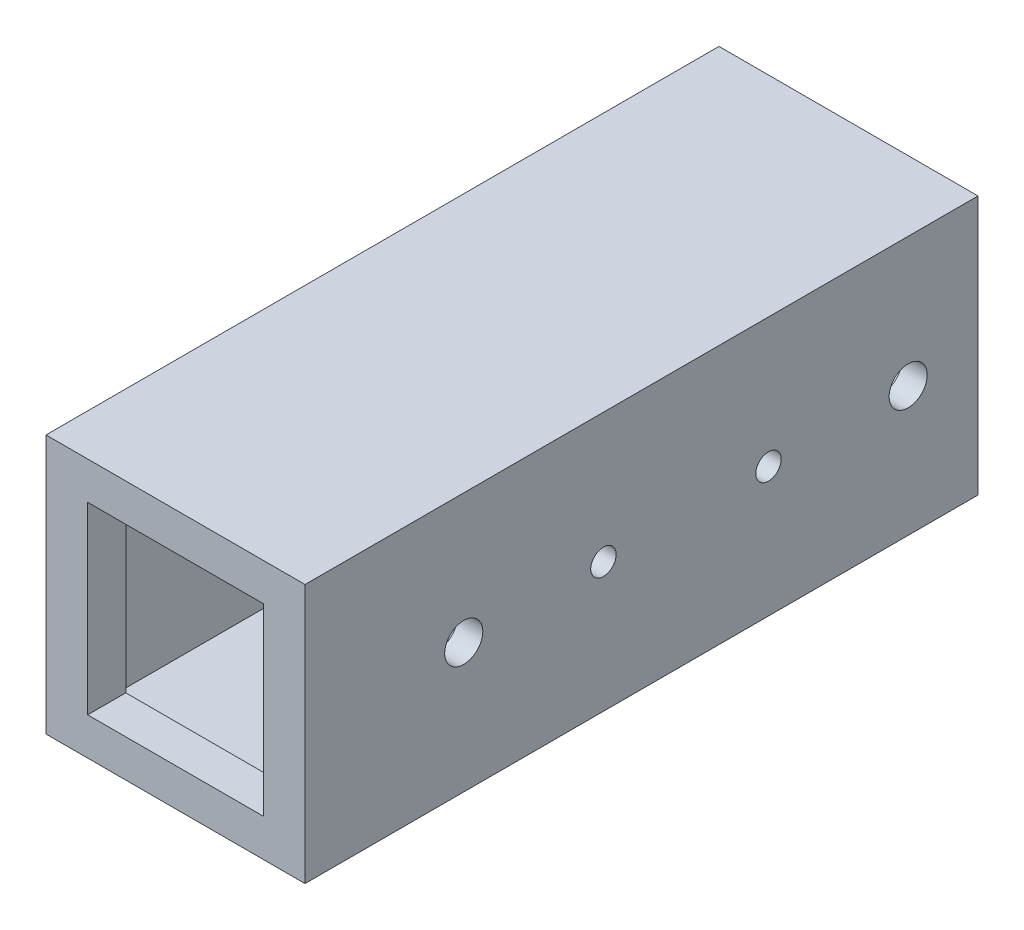
ISO-10303-21;
HEADER;
FILE_DESCRIPTION(('STEP AP214'),'2;1');
FILE_NAME('part.step','',(''),(''),'','','');
FILE_SCHEMA(('AUTOMOTIVE_DESIGN { 1 0 10303 214 1 1 1 1 }'));
ENDSEC;
DATA;
#1=APPLICATION_CONTEXT('core data for automotive mechanical design processes');
#2=APPLICATION_PROTOCOL_DEFINITION('international standard','automotive_design',2000,#1);
#3=PRODUCT_CONTEXT('',#1,'mechanical');
#4=PRODUCT('Part','Part','',(#3));
#5=PRODUCT_RELATED_PRODUCT_CATEGORY('part','',(#4));
#6=PRODUCT_DEFINITION_FORMATION('','',#4);
#7=PRODUCT_DEFINITION_CONTEXT('part definition',#1,'design');
#8=PRODUCT_DEFINITION('design','',#6,#7);
#9=PRODUCT_DEFINITION_SHAPE('','',#8);
#10=(LENGTH_UNIT() NAMED_UNIT(*) SI_UNIT(.MILLI.,.METRE.));
#11=(NAMED_UNIT(*) PLANE_ANGLE_UNIT() SI_UNIT($,.RADIAN.));
#12=(NAMED_UNIT(*) SI_UNIT($,.STERADIAN.) SOLID_ANGLE_UNIT());
#13=UNCERTAINTY_MEASURE_WITH_UNIT(LENGTH_MEASURE(1.E-05),#10,'distance_accuracy_value','');
#14=(GEOMETRIC_REPRESENTATION_CONTEXT(3) GLOBAL_UNCERTAINTY_ASSIGNED_CONTEXT((#13)) GLOBAL_UNIT_ASSIGNED_CONTEXT((#10,
#11,#12)) REPRESENTATION_CONTEXT('',''));
#15=CARTESIAN_POINT('',(0.,0.,0.));
#16=DIRECTION('',(0.,0.,1.));
#17=DIRECTION('',(1.,0.,0.));
#18=AXIS2_PLACEMENT_3D('',#15,#16,#17);
#19=CARTESIAN_POINT('',(10.2,-10.2,-50.));
#20=DIRECTION('',(1.,0.,0.));
#21=DIRECTION('',(0.,0.,-1.));
#22=AXIS2_PLACEMENT_3D('',#19,#20,#21);
#23=PLANE('',#22);
#24=CARTESIAN_POINT('',(10.2,0.,-44.5));
#25=DIRECTION('',(1.,0.,0.));
#26=DIRECTION('',(0.,0.,-1.));
#27=AXIS2_PLACEMENT_3D('',#24,#25,#26);
#28=CIRCLE('',#27,1.5);
#29=CARTESIAN_POINT('',(10.2,0.,-46.));
#30=VERTEX_POINT('',#29);
#31=EDGE_CURVE('E282',#30,#30,#28,.T.);
#32=ORIENTED_EDGE('',*,*,#31,.F.);
#33=EDGE_LOOP('',(#32));
#34=FACE_BOUND('',#33,.T.);
#35=CARTESIAN_POINT('',(10.2,0.,-33.5));
#36=DIRECTION('',(1.,0.,0.));
#37=DIRECTION('',(0.,0.,-1.));
#38=AXIS2_PLACEMENT_3D('',#35,#36,#37);
#39=CIRCLE('',#38,0.999999999999998);
#40=CARTESIAN_POINT('',(10.2,0.,-34.5));
#41=VERTEX_POINT('',#40);
#42=EDGE_CURVE('E670',#41,#41,#39,.T.);
#43=ORIENTED_EDGE('',*,*,#42,.F.);
#44=EDGE_LOOP('',(#43));
#45=FACE_BOUND('',#44,.T.);
#46=CARTESIAN_POINT('',(10.2,0.,-9.5));
#47=DIRECTION('',(1.,0.,0.));
#48=DIRECTION('',(0.,0.,-1.));
#49=AXIS2_PLACEMENT_3D('',#46,#47,#48);
#50=CIRCLE('',#49,1.5);
#51=CARTESIAN_POINT('',(10.2,0.,-11.));
#52=VERTEX_POINT('',#51);
#53=EDGE_CURVE('E296',#52,#52,#50,.T.);
#54=ORIENTED_EDGE('',*,*,#53,.F.);
#55=EDGE_LOOP('',(#54));
#56=FACE_BOUND('',#55,.T.);
#57=CARTESIAN_POINT('',(10.2,0.,-20.5));
#58=DIRECTION('',(1.,0.,0.));
#59=DIRECTION('',(0.,0.,-1.));
#60=AXIS2_PLACEMENT_3D('',#57,#58,#59);
#61=CIRCLE('',#60,0.999999999999998);
#62=CARTESIAN_POINT('',(10.2,0.,-21.5));
#63=VERTEX_POINT('',#62);
#64=EDGE_CURVE('E293',#63,#63,#61,.T.);
#65=ORIENTED_EDGE('',*,*,#64,.F.);
#66=EDGE_LOOP('',(#65));
#67=FACE_BOUND('',#66,.T.);
#68=DIRECTION('',(0.,0.,1.));
#69=VECTOR('',#68,1.);
#70=CARTESIAN_POINT('',(10.2,10.2,-50.));
#71=LINE('',#70,#69);
#72=CARTESIAN_POINT('',(10.2,10.2,-50.));
#73=VERTEX_POINT('',#72);
#74=CARTESIAN_POINT('',(10.2,10.2,3.));
#75=VERTEX_POINT('',#74);
#76=EDGE_CURVE('E228',#73,#75,#71,.T.);
#77=ORIENTED_EDGE('',*,*,#76,.T.);
#78=DIRECTION('',(0.,1.,0.));
#79=VECTOR('',#78,1.);
#80=CARTESIAN_POINT('',(10.2,10.2,3.));
#81=LINE('',#80,#79);
#82=CARTESIAN_POINT('',(10.2,-10.2,3.));
#83=VERTEX_POINT('',#82);
#84=EDGE_CURVE('E159',#83,#75,#81,.T.);
#85=ORIENTED_EDGE('',*,*,#84,.F.);
#86=DIRECTION('',(0.,0.,1.));
#87=VECTOR('',#86,1.);
#88=CARTESIAN_POINT('',(10.2,-10.2,-50.));
#89=LINE('',#88,#87);
#90=CARTESIAN_POINT('',(10.2,-10.2,-50.));
#91=VERTEX_POINT('',#90);
#92=EDGE_CURVE('E229',#91,#83,#89,.T.);
#93=ORIENTED_EDGE('',*,*,#92,.F.);
#94=DIRECTION('',(0.,1.,0.));
#95=VECTOR('',#94,1.);
#96=CARTESIAN_POINT('',(10.2,-10.2,-50.));
#97=LINE('',#96,#95);
#98=EDGE_CURVE('E211',#91,#73,#97,.T.);
#99=ORIENTED_EDGE('',*,*,#98,.T.);
#100=EDGE_LOOP('',(#77,#85,#93,#99));
#101=FACE_BOUND('',#100,.T.);
#102=ADVANCED_FACE('F39',(#34,#45,#56,#67,#101),#23,.T.);
#103=CARTESIAN_POINT('',(-10.2,-10.2,-50.));
#104=DIRECTION('',(0.,-1.,0.));
#105=DIRECTION('',(0.,0.,-1.));
#106=AXIS2_PLACEMENT_3D('',#103,#104,#105);
#107=PLANE('',#106);
#108=ORIENTED_EDGE('',*,*,#92,.T.);
#109=DIRECTION('',(1.,0.,0.));
#110=VECTOR('',#109,1.);
#111=CARTESIAN_POINT('',(10.2,-10.2,3.));
#112=LINE('',#111,#110);
#113=CARTESIAN_POINT('',(-10.2,-10.2,3.));
#114=VERTEX_POINT('',#113);
#115=EDGE_CURVE('E193',#114,#83,#112,.T.);
#116=ORIENTED_EDGE('',*,*,#115,.F.);
#117=DIRECTION('',(0.,0.,1.));
#118=VECTOR('',#117,1.);
#119=CARTESIAN_POINT('',(-10.2,-10.2,-50.));
#120=LINE('',#119,#118);
#121=CARTESIAN_POINT('',(-10.2,-10.2,-50.));
#122=VERTEX_POINT('',#121);
#123=EDGE_CURVE('E232',#122,#114,#120,.T.);
#124=ORIENTED_EDGE('',*,*,#123,.F.);
#125=DIRECTION('',(1.,0.,0.));
#126=VECTOR('',#125,1.);
#127=CARTESIAN_POINT('',(-10.2,-10.2,-50.));
#128=LINE('',#127,#126);
#129=EDGE_CURVE('E225',#122,#91,#128,.T.);
#130=ORIENTED_EDGE('',*,*,#129,.T.);
#131=EDGE_LOOP('',(#108,#116,#124,#130));
#132=FACE_BOUND('',#131,.T.);
#133=ADVANCED_FACE('F329',(#132),#107,.T.);
#134=CARTESIAN_POINT('',(-10.2,-10.2,-50.));
#135=DIRECTION('',(-1.,0.,0.));
#136=DIRECTION('',(0.,0.,1.));
#137=AXIS2_PLACEMENT_3D('',#134,#135,#136);
#138=PLANE('',#137);
#139=CARTESIAN_POINT('',(-10.2,0.,-44.5));
#140=DIRECTION('',(1.,0.,0.));
#141=DIRECTION('',(0.,0.,-1.));
#142=AXIS2_PLACEMENT_3D('',#139,#140,#141);
#143=CIRCLE('',#142,1.5);
#144=CARTESIAN_POINT('',(-10.2,0.,-46.));
#145=VERTEX_POINT('',#144);
#146=EDGE_CURVE('E277',#145,#145,#143,.T.);
#147=ORIENTED_EDGE('',*,*,#146,.T.);
#148=EDGE_LOOP('',(#147));
#149=FACE_BOUND('',#148,.T.);
#150=CARTESIAN_POINT('',(-10.2,0.,-33.5));
#151=DIRECTION('',(1.,0.,0.));
#152=DIRECTION('',(0.,0.,-1.));
#153=AXIS2_PLACEMENT_3D('',#150,#151,#152);
#154=CIRCLE('',#153,0.999999999999998);
#155=CARTESIAN_POINT('',(-10.2,0.,-34.5));
#156=VERTEX_POINT('',#155);
#157=EDGE_CURVE('E287',#156,#156,#154,.T.);
#158=ORIENTED_EDGE('',*,*,#157,.T.);
#159=EDGE_LOOP('',(#158));
#160=FACE_BOUND('',#159,.T.);
#161=CARTESIAN_POINT('',(-10.2,0.,-9.5));
#162=DIRECTION('',(1.,0.,0.));
#163=DIRECTION('',(0.,0.,-1.));
#164=AXIS2_PLACEMENT_3D('',#161,#162,#163);
#165=CIRCLE('',#164,1.5);
#166=CARTESIAN_POINT('',(-10.2,0.,-11.));
#167=VERTEX_POINT('',#166);
#168=EDGE_CURVE('E668',#167,#167,#165,.T.);
#169=ORIENTED_EDGE('',*,*,#168,.T.);
#170=EDGE_LOOP('',(#169));
#171=FACE_BOUND('',#170,.T.);
#172=CARTESIAN_POINT('',(-10.2,0.,-20.5));
#173=DIRECTION('',(1.,0.,0.));
#174=DIRECTION('',(0.,0.,-1.));
#175=AXIS2_PLACEMENT_3D('',#172,#173,#174);
#176=CIRCLE('',#175,0.999999999999998);
#177=CARTESIAN_POINT('',(-10.2,0.,-21.5));
#178=VERTEX_POINT('',#177);
#179=EDGE_CURVE('E241',#178,#178,#176,.T.);
#180=ORIENTED_EDGE('',*,*,#179,.T.);
#181=EDGE_LOOP('',(#180));
#182=FACE_BOUND('',#181,.T.);
#183=ORIENTED_EDGE('',*,*,#123,.T.);
#184=DIRECTION('',(0.,-1.,0.));
#185=VECTOR('',#184,1.);
#186=CARTESIAN_POINT('',(-10.2,10.2,3.));
#187=LINE('',#186,#185);
#188=CARTESIAN_POINT('',(-10.2,10.2,3.));
#189=VERTEX_POINT('',#188);
#190=EDGE_CURVE('E190',#189,#114,#187,.T.);
#191=ORIENTED_EDGE('',*,*,#190,.F.);
#192=DIRECTION('',(0.,0.,1.));
#193=VECTOR('',#192,1.);
#194=CARTESIAN_POINT('',(-10.2,10.2,-50.));
#195=LINE('',#194,#193);
#196=CARTESIAN_POINT('',(-10.2,10.2,-50.));
#197=VERTEX_POINT('',#196);
#198=EDGE_CURVE('E234',#197,#189,#195,.T.);
#199=ORIENTED_EDGE('',*,*,#198,.F.);
#200=DIRECTION('',(0.,-1.,0.));
#201=VECTOR('',#200,1.);
#202=CARTESIAN_POINT('',(-10.2,-10.2,-50.));
#203=LINE('',#202,#201);
#204=EDGE_CURVE('E222',#197,#122,#203,.T.);
#205=ORIENTED_EDGE('',*,*,#204,.T.);
#206=EDGE_LOOP('',(#183,#191,#199,#205));
#207=FACE_BOUND('',#206,.T.);
#208=ADVANCED_FACE('F335',(#149,#160,#171,#182,#207),#138,.T.);
#209=CARTESIAN_POINT('',(-10.2,10.2,-50.));
#210=DIRECTION('',(0.,1.,0.));
#211=DIRECTION('',(0.,0.,1.));
#212=AXIS2_PLACEMENT_3D('',#209,#210,#211);
#213=PLANE('',#212);
#214=ORIENTED_EDGE('',*,*,#198,.T.);
#215=DIRECTION('',(-1.,0.,0.));
#216=VECTOR('',#215,1.);
#217=CARTESIAN_POINT('',(10.2,10.2,3.));
#218=LINE('',#217,#216);
#219=EDGE_CURVE('E187',#75,#189,#218,.T.);
#220=ORIENTED_EDGE('',*,*,#219,.F.);
#221=ORIENTED_EDGE('',*,*,#76,.F.);
#222=DIRECTION('',(-1.,0.,0.));
#223=VECTOR('',#222,1.);
#224=CARTESIAN_POINT('',(-10.2,10.2,-50.));
#225=LINE('',#224,#223);
#226=EDGE_CURVE('E219',#73,#197,#225,.T.);
#227=ORIENTED_EDGE('',*,*,#226,.T.);
#228=EDGE_LOOP('',(#214,#220,#221,#227));
#229=FACE_BOUND('',#228,.T.);
#230=ADVANCED_FACE('F342',(#229),#213,.T.);
#231=CARTESIAN_POINT('',(0.,0.,-50.));
#232=DIRECTION('',(0.,0.,-1.));
#233=DIRECTION('',(-1.,0.,0.));
#234=AXIS2_PLACEMENT_3D('',#231,#232,#233);
#235=PLANE('',#234);
#236=DIRECTION('',(-1.,0.,0.));
#237=VECTOR('',#236,1.);
#238=CARTESIAN_POINT('',(-8.2,9.2,-50.));
#239=LINE('',#238,#237);
#240=CARTESIAN_POINT('',(9.2,9.2,-50.));
#241=VERTEX_POINT('',#240);
#242=CARTESIAN_POINT('',(-9.2,9.2,-50.));
#243=VERTEX_POINT('',#242);
#244=EDGE_CURVE('E231',#241,#243,#239,.T.);
#245=ORIENTED_EDGE('',*,*,#244,.T.);
#246=DIRECTION('',(0.,-1.,0.));
#247=VECTOR('',#246,1.);
#248=CARTESIAN_POINT('',(-9.2,-8.2,-50.));
#249=LINE('',#248,#247);
#250=CARTESIAN_POINT('',(-9.2,-9.2,-50.));
#251=VERTEX_POINT('',#250);
#252=EDGE_CURVE('E258',#243,#251,#249,.T.);
#253=ORIENTED_EDGE('',*,*,#252,.T.);
#254=DIRECTION('',(1.,0.,0.));
#255=VECTOR('',#254,1.);
#256=CARTESIAN_POINT('',(8.2,-9.2,-50.));
#257=LINE('',#256,#255);
#258=CARTESIAN_POINT('',(9.2,-9.2,-50.));
#259=VERTEX_POINT('',#258);
#260=EDGE_CURVE('E256',#251,#259,#257,.T.);
#261=ORIENTED_EDGE('',*,*,#260,.T.);
#262=DIRECTION('',(0.,1.,0.));
#263=VECTOR('',#262,1.);
#264=CARTESIAN_POINT('',(9.2,8.2,-50.));
#265=LINE('',#264,#263);
#266=EDGE_CURVE('E254',#259,#241,#265,.T.);
#267=ORIENTED_EDGE('',*,*,#266,.T.);
#268=EDGE_LOOP('',(#245,#253,#261,#267));
#269=FACE_BOUND('',#268,.T.);
#270=ORIENTED_EDGE('',*,*,#98,.F.);
#271=ORIENTED_EDGE('',*,*,#129,.F.);
#272=ORIENTED_EDGE('',*,*,#204,.F.);
#273=ORIENTED_EDGE('',*,*,#226,.F.);
#274=EDGE_LOOP('',(#270,#271,#272,#273));
#275=FACE_BOUND('',#274,.T.);
#276=ADVANCED_FACE('F524',(#269,#275),#235,.T.);
#277=CARTESIAN_POINT('',(8.2,-8.2,-50.));
#278=DIRECTION('',(1.,0.,0.));
#279=DIRECTION('',(0.,0.,-1.));
#280=AXIS2_PLACEMENT_3D('',#277,#278,#279);
#281=PLANE('',#280);
#282=CARTESIAN_POINT('',(8.19999999999999,0.,-44.5));
#283=DIRECTION('',(1.,0.,0.));
#284=DIRECTION('',(0.,0.,-1.));
#285=AXIS2_PLACEMENT_3D('',#282,#283,#284);
#286=CIRCLE('',#285,1.5);
#287=CARTESIAN_POINT('',(8.19999999999999,0.,-46.));
#288=VERTEX_POINT('',#287);
#289=EDGE_CURVE('E174',#288,#288,#286,.T.);
#290=ORIENTED_EDGE('',*,*,#289,.T.);
#291=EDGE_LOOP('',(#290));
#292=FACE_BOUND('',#291,.T.);
#293=CARTESIAN_POINT('',(8.19999999999999,0.,-33.5));
#294=DIRECTION('',(1.,0.,0.));
#295=DIRECTION('',(0.,0.,-1.));
#296=AXIS2_PLACEMENT_3D('',#293,#294,#295);
#297=CIRCLE('',#296,0.999999999999998);
#298=CARTESIAN_POINT('',(8.19999999999999,0.,-34.5));
#299=VERTEX_POINT('',#298);
#300=EDGE_CURVE('E249',#299,#299,#297,.T.);
#301=ORIENTED_EDGE('',*,*,#300,.T.);
#302=EDGE_LOOP('',(#301));
#303=FACE_BOUND('',#302,.T.);
#304=CARTESIAN_POINT('',(8.19999999999999,0.,-9.5));
#305=DIRECTION('',(1.,0.,0.));
#306=DIRECTION('',(0.,0.,-1.));
#307=AXIS2_PLACEMENT_3D('',#304,#305,#306);
#308=CIRCLE('',#307,1.5);
#309=CARTESIAN_POINT('',(8.19999999999999,0.,-11.));
#310=VERTEX_POINT('',#309);
#311=EDGE_CURVE('E245',#310,#310,#308,.T.);
#312=ORIENTED_EDGE('',*,*,#311,.T.);
#313=EDGE_LOOP('',(#312));
#314=FACE_BOUND('',#313,.T.);
#315=CARTESIAN_POINT('',(8.19999999999999,0.,-20.5));
#316=DIRECTION('',(1.,0.,0.));
#317=DIRECTION('',(0.,0.,-1.));
#318=AXIS2_PLACEMENT_3D('',#315,#316,#317);
#319=CIRCLE('',#318,0.999999999999998);
#320=CARTESIAN_POINT('',(8.19999999999999,0.,-21.5));
#321=VERTEX_POINT('',#320);
#322=EDGE_CURVE('E240',#321,#321,#319,.T.);
#323=ORIENTED_EDGE('',*,*,#322,.T.);
#324=EDGE_LOOP('',(#323));
#325=FACE_BOUND('',#324,.T.);
#326=DIRECTION('',(0.,0.,1.));
#327=VECTOR('',#326,1.);
#328=CARTESIAN_POINT('',(8.2,8.2,-50.));
#329=LINE('',#328,#327);
#330=CARTESIAN_POINT('',(8.2,8.2,-49.));
#331=VERTEX_POINT('',#330);
#332=CARTESIAN_POINT('',(8.2,8.2,0.));
#333=VERTEX_POINT('',#332);
#334=EDGE_CURVE('E208',#331,#333,#329,.T.);
#335=ORIENTED_EDGE('',*,*,#334,.F.);
#336=DIRECTION('',(0.,1.,0.));
#337=VECTOR('',#336,1.);
#338=CARTESIAN_POINT('',(8.2,-8.2,-49.));
#339=LINE('',#338,#337);
#340=CARTESIAN_POINT('',(8.2,-8.2,-49.));
#341=VERTEX_POINT('',#340);
#342=EDGE_CURVE('E48',#331,#341,#339,.F.);
#343=ORIENTED_EDGE('',*,*,#342,.T.);
#344=DIRECTION('',(0.,0.,1.));
#345=VECTOR('',#344,1.);
#346=CARTESIAN_POINT('',(8.2,-8.2,-50.));
#347=LINE('',#346,#345);
#348=CARTESIAN_POINT('',(8.2,-8.2,0.));
#349=VERTEX_POINT('',#348);
#350=EDGE_CURVE('E209',#341,#349,#347,.T.);
#351=ORIENTED_EDGE('',*,*,#350,.T.);
#352=DIRECTION('',(0.,1.,0.));
#353=VECTOR('',#352,1.);
#354=CARTESIAN_POINT('',(8.2,-8.2,0.));
#355=LINE('',#354,#353);
#356=EDGE_CURVE('E196',#349,#333,#355,.T.);
#357=ORIENTED_EDGE('',*,*,#356,.T.);
#358=EDGE_LOOP('',(#335,#343,#351,#357));
#359=FACE_BOUND('',#358,.T.);
#360=ADVANCED_FACE('F305',(#292,#303,#314,#325,#359),#281,.F.);
#361=CARTESIAN_POINT('',(-8.2,-8.2,-50.));
#362=DIRECTION('',(0.,-1.,0.));
#363=DIRECTION('',(0.,0.,-1.));
#364=AXIS2_PLACEMENT_3D('',#361,#362,#363);
#365=PLANE('',#364);
#366=ORIENTED_EDGE('',*,*,#350,.F.);
#367=DIRECTION('',(1.,0.,0.));
#368=VECTOR('',#367,1.);
#369=CARTESIAN_POINT('',(-8.2,-8.2,-49.));
#370=LINE('',#369,#368);
#371=CARTESIAN_POINT('',(-8.2,-8.2,-49.));
#372=VERTEX_POINT('',#371);
#373=EDGE_CURVE('E264',#341,#372,#370,.F.);
#374=ORIENTED_EDGE('',*,*,#373,.T.);
#375=DIRECTION('',(0.,0.,1.));
#376=VECTOR('',#375,1.);
#377=CARTESIAN_POINT('',(-8.2,-8.2,-50.));
#378=LINE('',#377,#376);
#379=CARTESIAN_POINT('',(-8.2,-8.2,0.));
#380=VERTEX_POINT('',#379);
#381=EDGE_CURVE('E212',#372,#380,#378,.T.);
#382=ORIENTED_EDGE('',*,*,#381,.T.);
#383=DIRECTION('',(1.,0.,0.));
#384=VECTOR('',#383,1.);
#385=CARTESIAN_POINT('',(-8.2,-8.2,0.));
#386=LINE('',#385,#384);
#387=EDGE_CURVE('E205',#380,#349,#386,.T.);
#388=ORIENTED_EDGE('',*,*,#387,.T.);
#389=EDGE_LOOP('',(#366,#374,#382,#388));
#390=FACE_BOUND('',#389,.T.);
#391=ADVANCED_FACE('F571',(#390),#365,.F.);
#392=CARTESIAN_POINT('',(-8.2,-8.2,-50.));
#393=DIRECTION('',(-1.,0.,0.));
#394=DIRECTION('',(0.,0.,1.));
#395=AXIS2_PLACEMENT_3D('',#392,#393,#394);
#396=PLANE('',#395);
#397=CARTESIAN_POINT('',(-8.2,0.,-44.5));
#398=DIRECTION('',(-1.,0.,0.));
#399=DIRECTION('',(0.,0.,1.));
#400=AXIS2_PLACEMENT_3D('',#397,#398,#399);
#401=CIRCLE('',#400,1.5);
#402=CARTESIAN_POINT('',(-8.2,0.,-43.));
#403=VERTEX_POINT('',#402);
#404=EDGE_CURVE('E250',#403,#403,#401,.T.);
#405=ORIENTED_EDGE('',*,*,#404,.T.);
#406=EDGE_LOOP('',(#405));
#407=FACE_BOUND('',#406,.T.);
#408=CARTESIAN_POINT('',(-8.2,0.,-33.5));
#409=DIRECTION('',(-1.,0.,0.));
#410=DIRECTION('',(0.,0.,1.));
#411=AXIS2_PLACEMENT_3D('',#408,#409,#410);
#412=CIRCLE('',#411,0.999999999999998);
#413=CARTESIAN_POINT('',(-8.2,0.,-32.5));
#414=VERTEX_POINT('',#413);
#415=EDGE_CURVE('E246',#414,#414,#412,.T.);
#416=ORIENTED_EDGE('',*,*,#415,.T.);
#417=EDGE_LOOP('',(#416));
#418=FACE_BOUND('',#417,.T.);
#419=CARTESIAN_POINT('',(-8.2,0.,-9.5));
#420=DIRECTION('',(-1.,0.,0.));
#421=DIRECTION('',(0.,0.,1.));
#422=AXIS2_PLACEMENT_3D('',#419,#420,#421);
#423=CIRCLE('',#422,1.5);
#424=CARTESIAN_POINT('',(-8.2,0.,-8.));
#425=VERTEX_POINT('',#424);
#426=EDGE_CURVE('E242',#425,#425,#423,.T.);
#427=ORIENTED_EDGE('',*,*,#426,.T.);
#428=EDGE_LOOP('',(#427));
#429=FACE_BOUND('',#428,.T.);
#430=CARTESIAN_POINT('',(-8.2,0.,-20.5));
#431=DIRECTION('',(-1.,0.,0.));
#432=DIRECTION('',(0.,0.,1.));
#433=AXIS2_PLACEMENT_3D('',#430,#431,#432);
#434=CIRCLE('',#433,0.999999999999998);
#435=CARTESIAN_POINT('',(-8.2,0.,-19.5));
#436=VERTEX_POINT('',#435);
#437=EDGE_CURVE('E237',#436,#436,#434,.T.);
#438=ORIENTED_EDGE('',*,*,#437,.T.);
#439=EDGE_LOOP('',(#438));
#440=FACE_BOUND('',#439,.T.);
#441=ORIENTED_EDGE('',*,*,#381,.F.);
#442=DIRECTION('',(0.,-1.,0.));
#443=VECTOR('',#442,1.);
#444=CARTESIAN_POINT('',(-8.2,8.2,-49.));
#445=LINE('',#444,#443);
#446=CARTESIAN_POINT('',(-8.2,8.2,-49.));
#447=VERTEX_POINT('',#446);
#448=EDGE_CURVE('E261',#372,#447,#445,.F.);
#449=ORIENTED_EDGE('',*,*,#448,.T.);
#450=DIRECTION('',(0.,0.,1.));
#451=VECTOR('',#450,1.);
#452=CARTESIAN_POINT('',(-8.2,8.2,-50.));
#453=LINE('',#452,#451);
#454=CARTESIAN_POINT('',(-8.2,8.2,0.));
#455=VERTEX_POINT('',#454);
#456=EDGE_CURVE('E214',#447,#455,#453,.T.);
#457=ORIENTED_EDGE('',*,*,#456,.T.);
#458=DIRECTION('',(0.,-1.,0.));
#459=VECTOR('',#458,1.);
#460=CARTESIAN_POINT('',(-8.2,-8.2,0.));
#461=LINE('',#460,#459);
#462=EDGE_CURVE('E202',#455,#380,#461,.T.);
#463=ORIENTED_EDGE('',*,*,#462,.T.);
#464=EDGE_LOOP('',(#441,#449,#457,#463));
#465=FACE_BOUND('',#464,.T.);
#466=ADVANCED_FACE('F561',(#407,#418,#429,#440,#465),#396,.F.);
#467=CARTESIAN_POINT('',(-8.2,8.2,-50.));
#468=DIRECTION('',(0.,1.,0.));
#469=DIRECTION('',(0.,0.,1.));
#470=AXIS2_PLACEMENT_3D('',#467,#468,#469);
#471=PLANE('',#470);
#472=ORIENTED_EDGE('',*,*,#456,.F.);
#473=DIRECTION('',(-1.,0.,0.));
#474=VECTOR('',#473,1.);
#475=CARTESIAN_POINT('',(8.2,8.2,-49.));
#476=LINE('',#475,#474);
#477=EDGE_CURVE('E11',#447,#331,#476,.F.);
#478=ORIENTED_EDGE('',*,*,#477,.T.);
#479=ORIENTED_EDGE('',*,*,#334,.T.);
#480=DIRECTION('',(-1.,0.,0.));
#481=VECTOR('',#480,1.);
#482=CARTESIAN_POINT('',(-8.2,8.2,0.));
#483=LINE('',#482,#481);
#484=EDGE_CURVE('E199',#333,#455,#483,.T.);
#485=ORIENTED_EDGE('',*,*,#484,.T.);
#486=EDGE_LOOP('',(#472,#478,#479,#485));
#487=FACE_BOUND('',#486,.T.);
#488=ADVANCED_FACE('F512',(#487),#471,.F.);
#489=CARTESIAN_POINT('',(0.,0.,0.));
#490=DIRECTION('',(0.,0.,-1.));
#491=DIRECTION('',(-1.,0.,0.));
#492=AXIS2_PLACEMENT_3D('',#489,#490,#491);
#493=PLANE('',#492);
#494=DIRECTION('',(-1.,0.,0.));
#495=VECTOR('',#494,1.);
#496=CARTESIAN_POINT('',(6.9173511930245,7.24862700945783,0.));
#497=LINE('',#496,#495);
#498=CARTESIAN_POINT('',(6.9173511930245,7.24862700945783,0.));
#499=VERTEX_POINT('',#498);
#500=CARTESIAN_POINT('',(-6.9173511930245,7.24862700945783,0.));
#501=VERTEX_POINT('',#500);
#502=EDGE_CURVE('E152',#499,#501,#497,.T.);
#503=ORIENTED_EDGE('',*,*,#502,.T.);
#504=DIRECTION('',(0.,-1.,0.));
#505=VECTOR('',#504,1.);
#506=CARTESIAN_POINT('',(-6.9173511930245,-7.24862700945783,0.));
#507=LINE('',#506,#505);
#508=CARTESIAN_POINT('',(-6.9173511930245,-7.24862700945783,0.));
#509=VERTEX_POINT('',#508);
#510=EDGE_CURVE('E172',#501,#509,#507,.T.);
#511=ORIENTED_EDGE('',*,*,#510,.T.);
#512=DIRECTION('',(1.,0.,0.));
#513=VECTOR('',#512,1.);
#514=CARTESIAN_POINT('',(6.9173511930245,-7.24862700945783,0.));
#515=LINE('',#514,#513);
#516=CARTESIAN_POINT('',(6.9173511930245,-7.24862700945783,0.));
#517=VERTEX_POINT('',#516);
#518=EDGE_CURVE('E158',#509,#517,#515,.T.);
#519=ORIENTED_EDGE('',*,*,#518,.T.);
#520=DIRECTION('',(0.,1.,0.));
#521=VECTOR('',#520,1.);
#522=CARTESIAN_POINT('',(6.9173511930245,-7.24862700945783,0.));
#523=LINE('',#522,#521);
#524=EDGE_CURVE('E176',#517,#499,#523,.T.);
#525=ORIENTED_EDGE('',*,*,#524,.T.);
#526=EDGE_LOOP('',(#503,#511,#519,#525));
#527=FACE_BOUND('',#526,.T.);
#528=ORIENTED_EDGE('',*,*,#484,.F.);
#529=ORIENTED_EDGE('',*,*,#356,.F.);
#530=ORIENTED_EDGE('',*,*,#387,.F.);
#531=ORIENTED_EDGE('',*,*,#462,.F.);
#532=EDGE_LOOP('',(#528,#529,#530,#531));
#533=FACE_BOUND('',#532,.T.);
#534=ADVANCED_FACE('F501',(#527,#533),#493,.T.);
#535=CARTESIAN_POINT('',(0.,0.,3.));
#536=DIRECTION('',(0.,0.,-1.));
#537=DIRECTION('',(-1.,0.,0.));
#538=AXIS2_PLACEMENT_3D('',#535,#536,#537);
#539=PLANE('',#538);
#540=ORIENTED_EDGE('',*,*,#84,.T.);
#541=ORIENTED_EDGE('',*,*,#219,.T.);
#542=ORIENTED_EDGE('',*,*,#190,.T.);
#543=ORIENTED_EDGE('',*,*,#115,.T.);
#544=EDGE_LOOP('',(#540,#541,#542,#543));
#545=FACE_BOUND('',#544,.T.);
#546=DIRECTION('',(0.,-1.,0.));
#547=VECTOR('',#546,1.);
#548=CARTESIAN_POINT('',(-6.9173511930245,-7.24862700945783,3.));
#549=LINE('',#548,#547);
#550=CARTESIAN_POINT('',(-6.9173511930245,7.24862700945783,3.));
#551=VERTEX_POINT('',#550);
#552=CARTESIAN_POINT('',(-6.9173511930245,-7.24862700945783,3.));
#553=VERTEX_POINT('',#552);
#554=EDGE_CURVE('E141',#551,#553,#549,.T.);
#555=ORIENTED_EDGE('',*,*,#554,.F.);
#556=DIRECTION('',(-1.,0.,0.));
#557=VECTOR('',#556,1.);
#558=CARTESIAN_POINT('',(6.9173511930245,7.24862700945783,3.));
#559=LINE('',#558,#557);
#560=CARTESIAN_POINT('',(6.9173511930245,7.24862700945783,3.));
#561=VERTEX_POINT('',#560);
#562=EDGE_CURVE('E167',#561,#551,#559,.T.);
#563=ORIENTED_EDGE('',*,*,#562,.F.);
#564=DIRECTION('',(0.,1.,0.));
#565=VECTOR('',#564,1.);
#566=CARTESIAN_POINT('',(6.9173511930245,-7.24862700945783,3.));
#567=LINE('',#566,#565);
#568=CARTESIAN_POINT('',(6.9173511930245,-7.24862700945783,3.));
#569=VERTEX_POINT('',#568);
#570=EDGE_CURVE('E165',#569,#561,#567,.T.);
#571=ORIENTED_EDGE('',*,*,#570,.F.);
#572=DIRECTION('',(1.,0.,0.));
#573=VECTOR('',#572,1.);
#574=CARTESIAN_POINT('',(6.9173511930245,-7.24862700945783,3.));
#575=LINE('',#574,#573);
#576=EDGE_CURVE('E151',#553,#569,#575,.T.);
#577=ORIENTED_EDGE('',*,*,#576,.F.);
#578=EDGE_LOOP('',(#555,#563,#571,#577));
#579=FACE_BOUND('',#578,.T.);
#580=ADVANCED_FACE('F163',(#545,#579),#539,.F.);
#581=CARTESIAN_POINT('',(-6.9173511930245,-7.24862700945783,3.));
#582=DIRECTION('',(1.,0.,0.));
#583=DIRECTION('',(0.,0.,-1.));
#584=AXIS2_PLACEMENT_3D('',#581,#582,#583);
#585=PLANE('',#584);
#586=ORIENTED_EDGE('',*,*,#510,.F.);
#587=DIRECTION('',(0.,0.,-1.));
#588=VECTOR('',#587,1.);
#589=CARTESIAN_POINT('',(-6.9173511930245,7.24862700945783,3.));
#590=LINE('',#589,#588);
#591=EDGE_CURVE('E147',#551,#501,#590,.T.);
#592=ORIENTED_EDGE('',*,*,#591,.F.);
#593=ORIENTED_EDGE('',*,*,#554,.T.);
#594=DIRECTION('',(0.,0.,-1.));
#595=VECTOR('',#594,1.);
#596=CARTESIAN_POINT('',(-6.9173511930245,-7.24862700945783,3.));
#597=LINE('',#596,#595);
#598=EDGE_CURVE('E144',#553,#509,#597,.T.);
#599=ORIENTED_EDGE('',*,*,#598,.T.);
#600=EDGE_LOOP('',(#586,#592,#593,#599));
#601=FACE_BOUND('',#600,.T.);
#602=ADVANCED_FACE('F143',(#601),#585,.T.);
#603=CARTESIAN_POINT('',(6.9173511930245,-7.24862700945783,3.));
#604=DIRECTION('',(0.,1.,0.));
#605=DIRECTION('',(0.,0.,1.));
#606=AXIS2_PLACEMENT_3D('',#603,#604,#605);
#607=PLANE('',#606);
#608=ORIENTED_EDGE('',*,*,#518,.F.);
#609=ORIENTED_EDGE('',*,*,#598,.F.);
#610=ORIENTED_EDGE('',*,*,#576,.T.);
#611=DIRECTION('',(0.,0.,-1.));
#612=VECTOR('',#611,1.);
#613=CARTESIAN_POINT('',(6.9173511930245,-7.24862700945783,3.));
#614=LINE('',#613,#612);
#615=EDGE_CURVE('E160',#569,#517,#614,.T.);
#616=ORIENTED_EDGE('',*,*,#615,.T.);
#617=EDGE_LOOP('',(#608,#609,#610,#616));
#618=FACE_BOUND('',#617,.T.);
#619=ADVANCED_FACE('F155',(#618),#607,.T.);
#620=CARTESIAN_POINT('',(6.9173511930245,-7.24862700945783,3.));
#621=DIRECTION('',(-1.,0.,0.));
#622=DIRECTION('',(0.,0.,1.));
#623=AXIS2_PLACEMENT_3D('',#620,#621,#622);
#624=PLANE('',#623);
#625=ORIENTED_EDGE('',*,*,#524,.F.);
#626=ORIENTED_EDGE('',*,*,#615,.F.);
#627=ORIENTED_EDGE('',*,*,#570,.T.);
#628=DIRECTION('',(0.,0.,-1.));
#629=VECTOR('',#628,1.);
#630=CARTESIAN_POINT('',(6.9173511930245,7.24862700945783,3.));
#631=LINE('',#630,#629);
#632=EDGE_CURVE('E182',#561,#499,#631,.T.);
#633=ORIENTED_EDGE('',*,*,#632,.T.);
#634=EDGE_LOOP('',(#625,#626,#627,#633));
#635=FACE_BOUND('',#634,.T.);
#636=ADVANCED_FACE('F462',(#635),#624,.T.);
#637=CARTESIAN_POINT('',(6.9173511930245,7.24862700945783,3.));
#638=DIRECTION('',(0.,-1.,0.));
#639=DIRECTION('',(0.,0.,-1.));
#640=AXIS2_PLACEMENT_3D('',#637,#638,#639);
#641=PLANE('',#640);
#642=ORIENTED_EDGE('',*,*,#502,.F.);
#643=ORIENTED_EDGE('',*,*,#632,.F.);
#644=ORIENTED_EDGE('',*,*,#562,.T.);
#645=ORIENTED_EDGE('',*,*,#591,.T.);
#646=EDGE_LOOP('',(#642,#643,#644,#645));
#647=FACE_BOUND('',#646,.T.);
#648=ADVANCED_FACE('F451',(#647),#641,.T.);
#649=CARTESIAN_POINT('',(-10.2,0.,-20.5));
#650=DIRECTION('',(1.,0.,0.));
#651=DIRECTION('',(0.,0.,-1.));
#652=AXIS2_PLACEMENT_3D('',#649,#650,#651);
#653=CYLINDRICAL_SURFACE('',#652,0.999999999999998);
#654=ORIENTED_EDGE('',*,*,#179,.F.);
#655=EDGE_LOOP('',(#654));
#656=FACE_BOUND('',#655,.T.);
#657=ORIENTED_EDGE('',*,*,#437,.F.);
#658=EDGE_LOOP('',(#657));
#659=FACE_BOUND('',#658,.T.);
#660=ADVANCED_FACE('F417',(#656,#659),#653,.F.);
#661=CARTESIAN_POINT('',(-10.2,0.,-9.5));
#662=DIRECTION('',(1.,0.,0.));
#663=DIRECTION('',(0.,0.,-1.));
#664=AXIS2_PLACEMENT_3D('',#661,#662,#663);
#665=CYLINDRICAL_SURFACE('',#664,1.5);
#666=ORIENTED_EDGE('',*,*,#168,.F.);
#667=EDGE_LOOP('',(#666));
#668=FACE_BOUND('',#667,.T.);
#669=ORIENTED_EDGE('',*,*,#426,.F.);
#670=EDGE_LOOP('',(#669));
#671=FACE_BOUND('',#670,.T.);
#672=ADVANCED_FACE('F407',(#668,#671),#665,.F.);
#673=CARTESIAN_POINT('',(-10.2,0.,-33.5));
#674=DIRECTION('',(1.,0.,0.));
#675=DIRECTION('',(0.,0.,-1.));
#676=AXIS2_PLACEMENT_3D('',#673,#674,#675);
#677=CYLINDRICAL_SURFACE('',#676,0.999999999999998);
#678=ORIENTED_EDGE('',*,*,#157,.F.);
#679=EDGE_LOOP('',(#678));
#680=FACE_BOUND('',#679,.T.);
#681=ORIENTED_EDGE('',*,*,#415,.F.);
#682=EDGE_LOOP('',(#681));
#683=FACE_BOUND('',#682,.T.);
#684=ADVANCED_FACE('F323',(#680,#683),#677,.F.);
#685=CARTESIAN_POINT('',(-10.2,0.,-44.5));
#686=DIRECTION('',(1.,0.,0.));
#687=DIRECTION('',(0.,0.,-1.));
#688=AXIS2_PLACEMENT_3D('',#685,#686,#687);
#689=CYLINDRICAL_SURFACE('',#688,1.5);
#690=ORIENTED_EDGE('',*,*,#146,.F.);
#691=EDGE_LOOP('',(#690));
#692=FACE_BOUND('',#691,.T.);
#693=ORIENTED_EDGE('',*,*,#404,.F.);
#694=EDGE_LOOP('',(#693));
#695=FACE_BOUND('',#694,.T.);
#696=ADVANCED_FACE('F313',(#692,#695),#689,.F.);
#697=ORIENTED_EDGE('',*,*,#64,.T.);
#698=EDGE_LOOP('',(#697));
#699=FACE_BOUND('',#698,.T.);
#700=ORIENTED_EDGE('',*,*,#322,.F.);
#701=EDGE_LOOP('',(#700));
#702=FACE_BOUND('',#701,.T.);
#703=ADVANCED_FACE('F326',(#699,#702),#653,.F.);
#704=ORIENTED_EDGE('',*,*,#53,.T.);
#705=EDGE_LOOP('',(#704));
#706=FACE_BOUND('',#705,.T.);
#707=ORIENTED_EDGE('',*,*,#311,.F.);
#708=EDGE_LOOP('',(#707));
#709=FACE_BOUND('',#708,.T.);
#710=ADVANCED_FACE('F320',(#706,#709),#665,.F.);
#711=ORIENTED_EDGE('',*,*,#42,.T.);
#712=EDGE_LOOP('',(#711));
#713=FACE_BOUND('',#712,.T.);
#714=ORIENTED_EDGE('',*,*,#300,.F.);
#715=EDGE_LOOP('',(#714));
#716=FACE_BOUND('',#715,.T.);
#717=ADVANCED_FACE('F310',(#713,#716),#677,.F.);
#718=ORIENTED_EDGE('',*,*,#31,.T.);
#719=EDGE_LOOP('',(#718));
#720=FACE_BOUND('',#719,.T.);
#721=ORIENTED_EDGE('',*,*,#289,.F.);
#722=EDGE_LOOP('',(#721));
#723=FACE_BOUND('',#722,.T.);
#724=ADVANCED_FACE('F308',(#720,#723),#689,.F.);
#725=CARTESIAN_POINT('',(9.2,0.,-49.));
#726=DIRECTION('',(0.,-1.,0.));
#727=DIRECTION('',(0.,0.,-1.));
#728=AXIS2_PLACEMENT_3D('',#725,#726,#727);
#729=CYLINDRICAL_SURFACE('',#728,1.);
#730=CARTESIAN_POINT('',(9.2,-9.2,-49.));
#731=DIRECTION('',(-0.707106781186547,-0.707106781186547,0.));
#732=DIRECTION('',(-0.707106781186547,0.707106781186547,0.));
#733=AXIS2_PLACEMENT_3D('',#730,#731,#732);
#734=ELLIPSE('',#733,1.41421356237309,1.);
#735=EDGE_CURVE('E270',#341,#259,#734,.T.);
#736=ORIENTED_EDGE('',*,*,#735,.F.);
#737=ORIENTED_EDGE('',*,*,#342,.F.);
#738=CARTESIAN_POINT('',(9.2,9.2,-49.));
#739=DIRECTION('',(0.707106781186547,-0.707106781186547,0.));
#740=DIRECTION('',(-0.707106781186547,-0.707106781186547,0.));
#741=AXIS2_PLACEMENT_3D('',#738,#739,#740);
#742=ELLIPSE('',#741,1.41421356237309,1.);
#743=EDGE_CURVE('E43',#241,#331,#742,.F.);
#744=ORIENTED_EDGE('',*,*,#743,.F.);
#745=ORIENTED_EDGE('',*,*,#266,.F.);
#746=EDGE_LOOP('',(#736,#737,#744,#745));
#747=FACE_BOUND('',#746,.T.);
#748=ADVANCED_FACE('F41',(#747),#729,.T.);
#749=CARTESIAN_POINT('',(0.,9.2,-49.));
#750=DIRECTION('',(1.,0.,0.));
#751=DIRECTION('',(0.,0.,-1.));
#752=AXIS2_PLACEMENT_3D('',#749,#750,#751);
#753=CYLINDRICAL_SURFACE('',#752,1.);
#754=ORIENTED_EDGE('',*,*,#743,.T.);
#755=ORIENTED_EDGE('',*,*,#477,.F.);
#756=CARTESIAN_POINT('',(-9.2,9.2,-49.));
#757=DIRECTION('',(0.707106781186547,0.707106781186547,0.));
#758=DIRECTION('',(-0.707106781186547,0.707106781186547,0.));
#759=AXIS2_PLACEMENT_3D('',#756,#757,#758);
#760=ELLIPSE('',#759,1.41421356237309,1.);
#761=EDGE_CURVE('E269',#243,#447,#760,.F.);
#762=ORIENTED_EDGE('',*,*,#761,.F.);
#763=ORIENTED_EDGE('',*,*,#244,.F.);
#764=EDGE_LOOP('',(#754,#755,#762,#763));
#765=FACE_BOUND('',#764,.T.);
#766=ADVANCED_FACE('F318',(#765),#753,.T.);
#767=CARTESIAN_POINT('',(0.,-9.2,-49.));
#768=DIRECTION('',(-1.,0.,0.));
#769=DIRECTION('',(0.,0.,1.));
#770=AXIS2_PLACEMENT_3D('',#767,#768,#769);
#771=CYLINDRICAL_SURFACE('',#770,1.);
#772=ORIENTED_EDGE('',*,*,#735,.T.);
#773=ORIENTED_EDGE('',*,*,#260,.F.);
#774=CARTESIAN_POINT('',(-9.2,-9.2,-49.));
#775=DIRECTION('',(-0.707106781186547,0.707106781186547,0.));
#776=DIRECTION('',(0.707106781186547,0.707106781186547,0.));
#777=AXIS2_PLACEMENT_3D('',#774,#775,#776);
#778=ELLIPSE('',#777,1.41421356237309,1.);
#779=EDGE_CURVE('E267',#372,#251,#778,.T.);
#780=ORIENTED_EDGE('',*,*,#779,.F.);
#781=ORIENTED_EDGE('',*,*,#373,.F.);
#782=EDGE_LOOP('',(#772,#773,#780,#781));
#783=FACE_BOUND('',#782,.T.);
#784=ADVANCED_FACE('F347',(#783),#771,.T.);
#785=CARTESIAN_POINT('',(-9.2,0.,-49.));
#786=DIRECTION('',(0.,1.,0.));
#787=DIRECTION('',(0.,0.,1.));
#788=AXIS2_PLACEMENT_3D('',#785,#786,#787);
#789=CYLINDRICAL_SURFACE('',#788,1.);
#790=ORIENTED_EDGE('',*,*,#761,.T.);
#791=ORIENTED_EDGE('',*,*,#448,.F.);
#792=ORIENTED_EDGE('',*,*,#779,.T.);
#793=ORIENTED_EDGE('',*,*,#252,.F.);
#794=EDGE_LOOP('',(#790,#791,#792,#793));
#795=FACE_BOUND('',#794,.T.);
#796=ADVANCED_FACE('F344',(#795),#789,.T.);
#797=CLOSED_SHELL('',(#102,#133,#208,#230,#276,#360,#391,#466,#488,#534,#580,#602,#619,#636,
#648,#660,#672,#684,#696,#703,#710,#717,#724,#748,#766,#784,#796));
#798=MANIFOLD_SOLID_BREP('B2',#797);
#799=ADVANCED_BREP_SHAPE_REPRESENTATION('',(#18,#798),#14);
#800=SHAPE_DEFINITION_REPRESENTATION(#9,#799);
ENDSEC;
END-ISO-10303-21;
